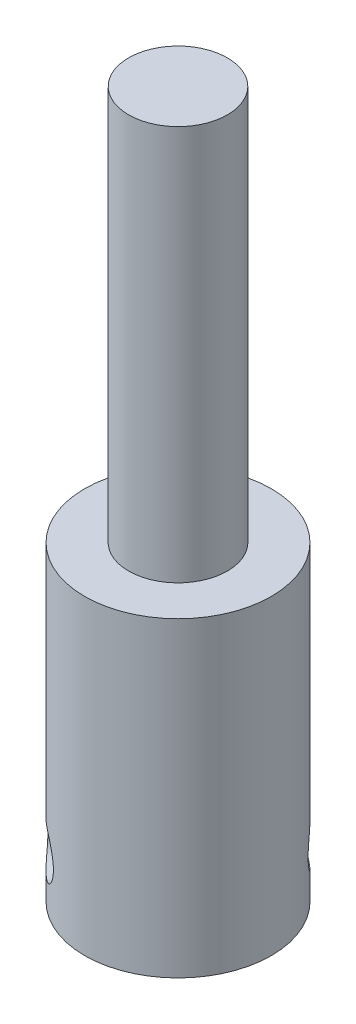
ISO-10303-21;
HEADER;
FILE_DESCRIPTION(('STEP AP214'),'2;1');
FILE_NAME('part.step','',(''),(''),'','','');
FILE_SCHEMA(('AUTOMOTIVE_DESIGN { 1 0 10303 214 1 1 1 1 }'));
ENDSEC;
DATA;
#1=APPLICATION_CONTEXT('core data for automotive mechanical design processes');
#2=APPLICATION_PROTOCOL_DEFINITION('international standard','automotive_design',2000,#1);
#3=PRODUCT_CONTEXT('',#1,'mechanical');
#4=PRODUCT('Part','Part','',(#3));
#5=PRODUCT_RELATED_PRODUCT_CATEGORY('part','',(#4));
#6=PRODUCT_DEFINITION_FORMATION('','',#4);
#7=PRODUCT_DEFINITION_CONTEXT('part definition',#1,'design');
#8=PRODUCT_DEFINITION('design','',#6,#7);
#9=PRODUCT_DEFINITION_SHAPE('','',#8);
#10=(LENGTH_UNIT() NAMED_UNIT(*) SI_UNIT(.MILLI.,.METRE.));
#11=(NAMED_UNIT(*) PLANE_ANGLE_UNIT() SI_UNIT($,.RADIAN.));
#12=(NAMED_UNIT(*) SI_UNIT($,.STERADIAN.) SOLID_ANGLE_UNIT());
#13=UNCERTAINTY_MEASURE_WITH_UNIT(LENGTH_MEASURE(1.E-05),#10,'distance_accuracy_value','');
#14=(GEOMETRIC_REPRESENTATION_CONTEXT(3) GLOBAL_UNCERTAINTY_ASSIGNED_CONTEXT((#13)) GLOBAL_UNIT_ASSIGNED_CONTEXT((#10,
#11,#12)) REPRESENTATION_CONTEXT('',''));
#15=CARTESIAN_POINT('',(0.,0.,0.));
#16=DIRECTION('',(0.,0.,1.));
#17=DIRECTION('',(1.,0.,0.));
#18=AXIS2_PLACEMENT_3D('',#15,#16,#17);
#19=CARTESIAN_POINT('',(0.,20.,0.));
#20=DIRECTION('',(0.,1.,0.));
#21=DIRECTION('',(0.,0.,1.));
#22=AXIS2_PLACEMENT_3D('',#19,#20,#21);
#23=PLANE('',#22);
#24=CARTESIAN_POINT('',(0.,20.,0.));
#25=DIRECTION('',(0.,1.,0.));
#26=DIRECTION('',(0.,0.,1.));
#27=AXIS2_PLACEMENT_3D('',#24,#25,#26);
#28=CIRCLE('',#27,6.00000000000001);
#29=CARTESIAN_POINT('',(0.,20.,6.00000000000001));
#30=VERTEX_POINT('',#29);
#31=EDGE_CURVE('E43',#30,#30,#28,.T.);
#32=ORIENTED_EDGE('',*,*,#31,.T.);
#33=EDGE_LOOP('',(#32));
#34=FACE_BOUND('',#33,.T.);
#35=CARTESIAN_POINT('',(0.,20.,0.));
#36=DIRECTION('',(0.,1.,0.));
#37=DIRECTION('',(0.,0.,1.));
#38=AXIS2_PLACEMENT_3D('',#35,#36,#37);
#39=CIRCLE('',#38,3.175);
#40=CARTESIAN_POINT('',(0.,20.,3.175));
#41=VERTEX_POINT('',#40);
#42=EDGE_CURVE('E105',#41,#41,#39,.T.);
#43=ORIENTED_EDGE('',*,*,#42,.F.);
#44=EDGE_LOOP('',(#43));
#45=FACE_BOUND('',#44,.T.);
#46=ADVANCED_FACE('F31',(#34,#45),#23,.T.);
#47=CARTESIAN_POINT('',(0.,20.,0.));
#48=DIRECTION('',(0.,-1.,0.));
#49=DIRECTION('',(0.,0.,-1.));
#50=AXIS2_PLACEMENT_3D('',#47,#48,#49);
#51=CYLINDRICAL_SURFACE('',#50,6.00000000000001);
#52=CARTESIAN_POINT('',(4.89662563452867,3.17484795335263,-3.46742806634496));
#53=CARTESIAN_POINT('',(4.89662485894614,3.2576784039074,-3.46743079298149));
#54=CARTESIAN_POINT('',(4.8925253121487,3.34053489255943,-3.47324075215723));
#55=CARTESIAN_POINT('',(4.87616284876844,3.50386850025705,-3.49617325525548));
#56=CARTESIAN_POINT('',(4.86389518114053,3.58434420603362,-3.51330238300854));
#57=CARTESIAN_POINT('',(4.83133261108637,3.74053007626485,-3.55794630959264));
#58=CARTESIAN_POINT('',(4.81104807048021,3.81624624658403,-3.58544770016953));
#59=CARTESIAN_POINT('',(4.7626331867595,3.96103446487658,-3.64951098563144));
#60=CARTESIAN_POINT('',(4.73450251054492,4.03010623060076,-3.68607326518032));
#61=CARTESIAN_POINT('',(4.67000890413774,4.16116494050995,-3.76746051506669));
#62=CARTESIAN_POINT('',(4.63349370459921,4.22298411356265,-3.81243503910686));
#63=CARTESIAN_POINT('',(4.55294291274857,4.33630478996883,-3.90827621542361));
#64=CARTESIAN_POINT('',(4.50890661806883,4.38780532872567,-3.95914341785308));
#65=CARTESIAN_POINT('',(4.41323308140103,4.47971323393139,-4.06553252192206));
#66=CARTESIAN_POINT('',(4.36149835428832,4.5199557862495,-4.12110946863815));
#67=CARTESIAN_POINT('',(4.2518312327126,4.58713373984447,-4.2341615281683));
#68=CARTESIAN_POINT('',(4.1938997542093,4.61407110450193,-4.29163635958471));
#69=CARTESIAN_POINT('',(4.07439399292291,4.65333665409977,-4.40522062719656));
#70=CARTESIAN_POINT('',(4.01291728164471,4.66594973994857,-4.46133413646471));
#71=CARTESIAN_POINT('',(3.88693454474598,4.67710298091795,-4.57151376009481));
#72=CARTESIAN_POINT('',(3.82242896840383,4.67564521667838,-4.62558017597109));
#73=CARTESIAN_POINT('',(3.69378018929982,4.65890304320254,-4.72891623351774));
#74=CARTESIAN_POINT('',(3.62966070655722,4.64392615832031,-4.77826569235987));
#75=CARTESIAN_POINT('',(3.50235941489659,4.60106519132352,-4.87234511672274));
#76=CARTESIAN_POINT('',(3.43917765607811,4.57318042212618,-4.91707483618111));
#77=CARTESIAN_POINT('',(3.3152115152108,4.50504641094038,-5.00150507628052));
#78=CARTESIAN_POINT('',(3.25445395275212,4.46468772655557,-5.04115650398639));
#79=CARTESIAN_POINT('',(3.13795540722681,4.37283454588287,-5.11448737407984));
#80=CARTESIAN_POINT('',(3.08221529932357,4.32133811221625,-5.14816577561978));
#81=CARTESIAN_POINT('',(2.9762563295335,4.2070227081632,-5.2101605620983));
#82=CARTESIAN_POINT('',(2.92622772783763,4.14393501794396,-5.23830715646718));
#83=CARTESIAN_POINT('',(2.8354259253561,4.00908796922847,-5.28800972948277));
#84=CARTESIAN_POINT('',(2.79465315716845,3.93732820565802,-5.30956540010003));
#85=CARTESIAN_POINT('',(2.7239206521514,3.78667393286324,-5.34620032659485));
#86=CARTESIAN_POINT('',(2.69401430528866,3.70774651516471,-5.36124767216186));
#87=CARTESIAN_POINT('',(2.64671760680476,3.54529667250675,-5.38475542951298));
#88=CARTESIAN_POINT('',(2.62932457686258,3.46177523496275,-5.39321725087898));
#89=CARTESIAN_POINT('',(2.60822098739137,3.29487225243876,-5.40345429629292));
#90=CARTESIAN_POINT('',(2.60416117761287,3.21154527735485,-5.40540022486696));
#91=CARTESIAN_POINT('',(2.60894630272862,3.04535479140573,-5.40309228939704));
#92=CARTESIAN_POINT('',(2.61779004969483,2.96249123858188,-5.39883899606625));
#93=CARTESIAN_POINT('',(2.64768597888494,2.80097939437981,-5.38423860088393));
#94=CARTESIAN_POINT('',(2.66853604487713,2.72228431741013,-5.37399234171036));
#95=CARTESIAN_POINT('',(2.72132723525573,2.56978907864162,-5.3474522357995));
#96=CARTESIAN_POINT('',(2.75326967346858,2.49598949791943,-5.33115767266032));
#97=CARTESIAN_POINT('',(2.82762525737383,2.35378318663222,-5.29210040473485));
#98=CARTESIAN_POINT('',(2.87023151648903,2.28551064932677,-5.26921708382239));
#99=CARTESIAN_POINT('',(2.96388975769978,2.15773493567182,-5.21710872446515));
#100=CARTESIAN_POINT('',(3.01494312761178,2.09823320336259,-5.18788264369153));
#101=CARTESIAN_POINT('',(3.12499582799806,1.98816132781006,-5.12236234498093));
#102=CARTESIAN_POINT('',(3.18416201367092,1.93785191582335,-5.08590957082877));
#103=CARTESIAN_POINT('',(3.30726304201433,1.84948643318189,-5.00673134960508));
#104=CARTESIAN_POINT('',(3.37119763573539,1.81142972338771,-4.96400622988813));
#105=CARTESIAN_POINT('',(3.50111091188824,1.74898033263588,-4.87323808211709));
#106=CARTESIAN_POINT('',(3.56707114043384,1.7244893827252,-4.82523640083326));
#107=CARTESIAN_POINT('',(3.69923459874202,1.68957175258759,-4.72467464108479));
#108=CARTESIAN_POINT('',(3.76543777913389,1.67914235810921,-4.67211544442622));
#109=CARTESIAN_POINT('',(3.89417827712817,1.67279656898934,-4.56532397072738));
#110=CARTESIAN_POINT('',(3.95676631430621,1.67649538970955,-4.51117535615051));
#111=CARTESIAN_POINT('',(4.07838976515126,1.69741969429414,-4.40152719576681));
#112=CARTESIAN_POINT('',(4.13742528441793,1.71464477587229,-4.34602769018456));
#113=CARTESIAN_POINT('',(4.25020092373664,1.76192628300903,-4.23579768130929));
#114=CARTESIAN_POINT('',(4.30396784005603,1.79191313332458,-4.1810646466031));
#115=CARTESIAN_POINT('',(4.4055171464449,1.86380382188163,-4.0739260422507));
#116=CARTESIAN_POINT('',(4.45329878102149,1.90570916235699,-4.02152076696393));
#117=CARTESIAN_POINT('',(4.54320713222031,2.00142080434825,-3.91969350968062));
#118=CARTESIAN_POINT('',(4.58517094901026,2.05548816771371,-3.87037307669371));
#119=CARTESIAN_POINT('',(4.66154018626199,2.17348223131334,-3.77804722981561));
#120=CARTESIAN_POINT('',(4.69594368790842,2.2374114274995,-3.73504342000575));
#121=CARTESIAN_POINT('',(4.75740763398115,2.37475007465464,-3.65644830207001));
#122=CARTESIAN_POINT('',(4.78431911288195,2.44831413847158,-3.62101024830584));
#123=CARTESIAN_POINT('',(4.82966067130263,2.60193118823669,-3.56031224363114));
#124=CARTESIAN_POINT('',(4.84809692221621,2.68197940251275,-3.53504488841173));
#125=CARTESIAN_POINT('',(4.87366029464848,2.83071347109271,-3.49968748077623));
#126=CARTESIAN_POINT('',(4.88226621351017,2.89868769992843,-3.48763157991128));
#127=CARTESIAN_POINT('',(4.89374896404775,3.03605125685258,-3.47150107071708));
#128=CARTESIAN_POINT('',(4.89662628442537,3.10544046372022,-3.46742578156931));
#129=CARTESIAN_POINT('',(4.89662563452867,3.17484795335263,-3.46742806634496));
#130=B_SPLINE_CURVE_WITH_KNOTS('',3,(#52,#53,#54,#55,#56,#57,#58,#59,#60,#61,#62,#63,#64,#65,
#66,#67,#68,#69,#70,#71,#72,#73,#74,#75,#76,#77,#78,#79,#80,#81,#82,#83,#84,#85,#86,#87,#88,#89,
#90,#91,#92,#93,#94,#95,#96,#97,#98,#99,#100,#101,#102,#103,#104,#105,#106,#107,#108,#109,#110,
#111,#112,#113,#114,#115,#116,#117,#118,#119,#120,#121,#122,#123,#124,#125,#126,#127,#128,#129),
.UNSPECIFIED.,.T.,.F.,(4,2,2,2,2,2,2,2,2,2,2,2,2,2,2,2,2,2,2,2,2,2,2,2,2,2,2,2,2,2,2,2,2,2,2,2,
2,2,4),(0.,0.24823646504168,0.496617444857197,0.744678436299609,0.992749960532867,
1.24574372515785,1.49876112887919,1.75530897838751,2.01181895908254,2.26313250597207,
2.51440889199611,2.76010957613367,3.0058233403487,3.25375724552665,3.50173431281346,
3.75642279943145,4.01112318719879,4.26705859205039,4.52293920077726,4.77206144857028,
5.02116076310278,5.26618443005521,5.51123712852848,5.76109707515491,6.01099811331023,
6.26715198579188,6.52329249431729,6.77755243684154,7.03176329345419,7.2791006767647,
7.52643070426184,7.77242925935822,8.01845883442839,8.27038257949238,8.52237018939301,
8.77905886370801,9.03556032819967,9.24358696306393,9.45159585059707),.UNSPECIFIED.);
#131=CARTESIAN_POINT('',(4.89662563452867,3.17484795335263,-3.46742806634496));
#132=VERTEX_POINT('',#131);
#133=EDGE_CURVE('E36',#132,#132,#130,.T.);
#134=ORIENTED_EDGE('',*,*,#133,.T.);
#135=EDGE_LOOP('',(#134));
#136=FACE_BOUND('',#135,.T.);
#137=CARTESIAN_POINT('',(-2.60588603582183,3.17484795335263,5.40456824994456));
#138=CARTESIAN_POINT('',(-2.60588885340934,3.09201750279786,5.40456793805411));
#139=CARTESIAN_POINT('',(-2.61229906695593,3.00916101414583,5.40149042739526));
#140=CARTESIAN_POINT('',(-2.63763092314554,2.84582740644821,5.38916456157535));
#141=CARTESIAN_POINT('',(-2.65655984734183,2.76535170067164,5.37991261500284));
#142=CARTESIAN_POINT('',(-2.7059924751468,2.60916583044041,5.35521815291771));
#143=CARTESIAN_POINT('',(-2.73648123558996,2.53344966012123,5.33978362804958));
#144=CARTESIAN_POINT('',(-2.80769664157322,2.38866144182868,5.30268279975015));
#145=CARTESIAN_POINT('',(-2.84842372176394,2.3195896761045,5.2810162317423));
#146=CARTESIAN_POINT('',(-2.93939323019589,2.18853096619531,5.2309377109263));
#147=CARTESIAN_POINT('',(-2.98980842768533,2.12671179314261,5.20240044630476));
#148=CARTESIAN_POINT('',(-3.09769829507203,2.01339111673643,5.13888873352023));
#149=CARTESIAN_POINT('',(-3.15517362414836,1.96189057797959,5.10391368413228));
#150=CARTESIAN_POINT('',(-3.27597689745842,1.86998267277387,5.0272414189988));
#151=CARTESIAN_POINT('',(-3.33937531515517,1.82974012045576,4.98545721589214));
#152=CARTESIAN_POINT('',(-3.46907343112187,1.76256216686079,4.8960925448336));
#153=CARTESIAN_POINT('',(-3.53537269975486,1.73562480220333,4.84851293337394));
#154=CARTESIAN_POINT('',(-3.66722991103876,1.69635925260549,4.74953471020341));
#155=CARTESIAN_POINT('',(-3.73277566272825,1.68374616675669,4.69823299105651));
#156=CARTESIAN_POINT('',(-3.86235140927727,1.67259292578731,4.59230223364379));
#157=CARTESIAN_POINT('',(-3.9263816268334,1.67405069002688,4.53767368849883));
#158=CARTESIAN_POINT('',(-4.04965173364571,1.69079286350273,4.4279771529076));
#159=CARTESIAN_POINT('',(-4.10896639111815,1.70576974838495,4.37294581125473));
#160=CARTESIAN_POINT('',(-4.22288463355498,1.74863071538174,4.26304043837869));
#161=CARTESIAN_POINT('',(-4.27748796755344,1.77651548457908,4.20816641568605));
#162=CARTESIAN_POINT('',(-4.381337080426,1.84464949576488,4.09994704921054));
#163=CARTESIAN_POINT('',(-4.43052999342893,1.88500818014969,4.04661999767644));
#164=CARTESIAN_POINT('',(-4.5221935038554,1.97686136082239,3.94392078407442));
#165=CARTESIAN_POINT('',(-4.56466292951927,2.02835779448901,3.89454931211812));
#166=CARTESIAN_POINT('',(-4.64339713061327,2.14267319854206,3.8003602341548));
#167=CARTESIAN_POINT('',(-4.67946287046955,2.2057608887613,3.75570204150408));
#168=CARTESIAN_POINT('',(-4.74355789456191,2.34060793747679,3.67441771961563));
#169=CARTESIAN_POINT('',(-4.77158680318966,2.41236770104724,3.63779196579976));
#170=CARTESIAN_POINT('',(-4.81946204373041,2.56302197384201,3.57412748238527));
#171=CARTESIAN_POINT('',(-4.83926804012378,2.64194939154055,3.54713610046153));
#172=CARTESIAN_POINT('',(-4.87030559589176,2.8043992341985,3.50440130813601));
#173=CARTESIAN_POINT('',(-4.8815389901573,2.88792067174251,3.48865549076521));
#174=CARTESIAN_POINT('',(-4.89513930135797,3.0548236542665,3.46954554250204));
#175=CARTESIAN_POINT('',(-4.8977325647143,3.13815062935041,3.46586536878092));
#176=CARTESIAN_POINT('',(-4.89466184265701,3.30434111529953,3.47020064899719));
#177=CARTESIAN_POINT('',(-4.88899861735279,3.38720466812337,3.4782150263101));
#178=CARTESIAN_POINT('',(-4.86963509254677,3.54871651232545,3.5052703775129));
#179=CARTESIAN_POINT('',(-4.85606780797427,3.62741158929513,3.5241287938902));
#180=CARTESIAN_POINT('',(-4.82112734917393,3.77990682806364,3.57177804721246));
#181=CARTESIAN_POINT('',(-4.79975325025915,3.85370640878583,3.60057006073115));
#182=CARTESIAN_POINT('',(-4.74888749675353,3.99591272007304,3.66740491807369));
#183=CARTESIAN_POINT('',(-4.71924482393032,4.06418525737849,3.70561815713648));
#184=CARTESIAN_POINT('',(-4.6523029573592,4.19196097103344,3.78931961328612));
#185=CARTESIAN_POINT('',(-4.61500250523502,4.25146270334267,3.83480902576958));
#186=CARTESIAN_POINT('',(-4.53211176696719,4.3615345788952,3.93244934487419));
#187=CARTESIAN_POINT('',(-4.48633741129726,4.41184399088191,3.98473845113417));
#188=CARTESIAN_POINT('',(-4.38781105607927,4.50020947352337,4.09297712824549));
#189=CARTESIAN_POINT('',(-4.3350594206906,4.53826618331755,4.14892650798223));
#190=CARTESIAN_POINT('',(-4.22397258029037,4.60071557406938,4.26195760927937));
#191=CARTESIAN_POINT('',(-4.16568121298477,4.62520652398006,4.31902800137114));
#192=CARTESIAN_POINT('',(-4.04456304419988,4.66012415411767,4.43265122270322));
#193=CARTESIAN_POINT('',(-3.98173712047702,4.67055354859605,4.48920414973413));
#194=CARTESIAN_POINT('',(-3.85504436661889,4.67689933771592,4.59841715627833));
#195=CARTESIAN_POINT('',(-3.79125161171701,4.67320051699571,4.65114114778527));
#196=CARTESIAN_POINT('',(-3.6629240591957,4.65227621241112,4.75286146107066));
#197=CARTESIAN_POINT('',(-3.59838928370103,4.63505113083297,4.80185789366337));
#198=CARTESIAN_POINT('',(-3.47095766205194,4.58776962369623,4.89475666375356));
#199=CARTESIAN_POINT('',(-3.40805386856626,4.55778277338068,4.93868500476204));
#200=CARTESIAN_POINT('',(-3.28553549255976,4.48589208482363,5.02102691214442));
#201=CARTESIAN_POINT('',(-3.22592132580271,4.44398674434827,5.05943978241671));
#202=CARTESIAN_POINT('',(-3.11057416967206,4.34827510235701,5.13118471613125));
#203=CARTESIAN_POINT('',(-3.05496837757239,4.29420773899155,5.16437301097392));
#204=CARTESIAN_POINT('',(-2.95123959433731,4.17621367539192,5.2243451872621));
#205=CARTESIAN_POINT('',(-2.90311850372992,4.11228447920576,5.2511274430008));
#206=CARTESIAN_POINT('',(-2.81540558964522,3.97494583205062,5.29868218969276));
#207=CARTESIAN_POINT('',(-2.77598963587134,3.90138176823368,5.31933324146536));
#208=CARTESIAN_POINT('',(-2.70860326371739,3.74776471846857,5.35396244214102));
#209=CARTESIAN_POINT('',(-2.68062451877236,3.66771650419251,5.36794544678358));
#210=CARTESIAN_POINT('',(-2.64151202259158,3.51898243561255,5.38728051666508));
#211=CARTESIAN_POINT('',(-2.62819409277024,3.45100820677683,5.39376429105917));
#212=CARTESIAN_POINT('',(-2.61038029516038,3.31364464985268,5.4024081039613));
#213=CARTESIAN_POINT('',(-2.60588367483412,3.24425544298504,5.40456851129209));
#214=CARTESIAN_POINT('',(-2.60588603582183,3.17484795335263,5.40456824994456));
#215=B_SPLINE_CURVE_WITH_KNOTS('',3,(#137,#138,#139,#140,#141,#142,#143,#144,#145,#146,#147,
#148,#149,#150,#151,#152,#153,#154,#155,#156,#157,#158,#159,#160,#161,#162,#163,#164,#165,#166,
#167,#168,#169,#170,#171,#172,#173,#174,#175,#176,#177,#178,#179,#180,#181,#182,#183,#184,#185,
#186,#187,#188,#189,#190,#191,#192,#193,#194,#195,#196,#197,#198,#199,#200,#201,#202,#203,#204,
#205,#206,#207,#208,#209,#210,#211,#212,#213,#214),.UNSPECIFIED.,.T.,.F.,(4,2,2,2,2,2,2,2,2,2,2,
2,2,2,2,2,2,2,2,2,2,2,2,2,2,2,2,2,2,2,2,2,2,2,2,2,2,2,4),(0.,0.24823646504168,0.496617444857197,
0.744678436299608,0.992749960532866,1.24574372515785,1.49876112887919,1.75530897838751,
2.01181895908254,2.26313250597207,2.51440889199611,2.76010957613367,3.0058233403487,
3.25375724552665,3.50173431281346,3.75642279943145,4.01112318719879,4.26705859205039,
4.52293920077726,4.77206144857028,5.02116076310278,5.26618443005521,5.51123712852847,
5.76109707515491,6.01099811331023,6.26715198579188,6.52329249431728,6.77755243684154,
7.03176329345419,7.2791006767647,7.52643070426184,7.77242925935822,8.01845883442839,
8.27038257949238,8.522370189393,8.77905886370801,9.03556032819967,9.24358696306393,
9.45159585059707),.UNSPECIFIED.);
#216=CARTESIAN_POINT('',(-2.60588603582183,3.17484795335263,5.40456824994456));
#217=VERTEX_POINT('',#216);
#218=EDGE_CURVE('E10',#217,#217,#215,.T.);
#219=ORIENTED_EDGE('',*,*,#218,.T.);
#220=EDGE_LOOP('',(#219));
#221=FACE_BOUND('',#220,.T.);
#222=ORIENTED_EDGE('',*,*,#31,.F.);
#223=EDGE_LOOP('',(#222));
#224=FACE_BOUND('',#223,.T.);
#225=CARTESIAN_POINT('',(0.,0.,0.));
#226=DIRECTION('',(0.,1.,0.));
#227=DIRECTION('',(0.,0.,1.));
#228=AXIS2_PLACEMENT_3D('',#225,#226,#227);
#229=CIRCLE('',#228,6.00000000000001);
#230=CARTESIAN_POINT('',(0.,0.,6.00000000000001));
#231=VERTEX_POINT('',#230);
#232=EDGE_CURVE('E47',#231,#231,#229,.T.);
#233=ORIENTED_EDGE('',*,*,#232,.T.);
#234=EDGE_LOOP('',(#233));
#235=FACE_BOUND('',#234,.T.);
#236=ADVANCED_FACE('F33',(#136,#221,#224,#235),#51,.T.);
#237=CARTESIAN_POINT('',(0.,0.,0.));
#238=DIRECTION('',(0.,1.,0.));
#239=DIRECTION('',(0.,0.,1.));
#240=AXIS2_PLACEMENT_3D('',#237,#238,#239);
#241=PLANE('',#240);
#242=CARTESIAN_POINT('',(0.,0.,0.));
#243=DIRECTION('',(0.,-1.,0.));
#244=DIRECTION('',(0.,0.,-1.));
#245=AXIS2_PLACEMENT_3D('',#242,#243,#244);
#246=CIRCLE('',#245,2.5);
#247=CARTESIAN_POINT('',(0.,0.,-2.5));
#248=VERTEX_POINT('',#247);
#249=EDGE_CURVE('E99',#248,#248,#246,.T.);
#250=ORIENTED_EDGE('',*,*,#249,.F.);
#251=EDGE_LOOP('',(#250));
#252=FACE_BOUND('',#251,.T.);
#253=ORIENTED_EDGE('',*,*,#232,.F.);
#254=EDGE_LOOP('',(#253));
#255=FACE_BOUND('',#254,.T.);
#256=ADVANCED_FACE('F86',(#252,#255),#241,.F.);
#257=CARTESIAN_POINT('',(0.,45.4,0.));
#258=DIRECTION('',(0.,-1.,0.));
#259=DIRECTION('',(0.,0.,-1.));
#260=AXIS2_PLACEMENT_3D('',#257,#258,#259);
#261=CYLINDRICAL_SURFACE('',#260,3.175);
#262=CARTESIAN_POINT('',(0.,45.4,0.));
#263=DIRECTION('',(0.,1.,0.));
#264=DIRECTION('',(0.,0.,1.));
#265=AXIS2_PLACEMENT_3D('',#262,#263,#264);
#266=CIRCLE('',#265,3.175);
#267=CARTESIAN_POINT('',(0.,45.4,3.175));
#268=VERTEX_POINT('',#267);
#269=EDGE_CURVE('E103',#268,#268,#266,.T.);
#270=ORIENTED_EDGE('',*,*,#269,.F.);
#271=EDGE_LOOP('',(#270));
#272=FACE_BOUND('',#271,.T.);
#273=ORIENTED_EDGE('',*,*,#42,.T.);
#274=EDGE_LOOP('',(#273));
#275=FACE_BOUND('',#274,.T.);
#276=ADVANCED_FACE('F82',(#272,#275),#261,.T.);
#277=CARTESIAN_POINT('',(0.,45.4,0.));
#278=DIRECTION('',(0.,1.,0.));
#279=DIRECTION('',(0.,0.,1.));
#280=AXIS2_PLACEMENT_3D('',#277,#278,#279);
#281=PLANE('',#280);
#282=ORIENTED_EDGE('',*,*,#269,.T.);
#283=EDGE_LOOP('',(#282));
#284=FACE_BOUND('',#283,.T.);
#285=ADVANCED_FACE('F77',(#284),#281,.T.);
#286=CARTESIAN_POINT('',(0.,6.5,0.));
#287=DIRECTION('',(0.,-1.,0.));
#288=DIRECTION('',(0.,0.,-1.));
#289=AXIS2_PLACEMENT_3D('',#286,#287,#288);
#290=CYLINDRICAL_SURFACE('',#289,2.5);
#291=CARTESIAN_POINT('',(2.43679658841984,3.17484795335263,-0.558589640671442));
#292=CARTESIAN_POINT('',(2.43679590729424,3.09936897806299,-0.558582576887806));
#293=CARTESIAN_POINT('',(2.43522018417812,3.02390951927284,-0.565601669937329));
#294=CARTESIAN_POINT('',(2.42873732899896,2.87552404939042,-0.592809869690468));
#295=CARTESIAN_POINT('',(2.4238267200391,2.80260076596753,-0.613012720701844));
#296=CARTESIAN_POINT('',(2.41025250858243,2.66176431167536,-0.664358875580718));
#297=CARTESIAN_POINT('',(2.40161592475778,2.59381911531737,-0.695423117045619));
#298=CARTESIAN_POINT('',(2.3799693976656,2.46341049998471,-0.766234099637743));
#299=CARTESIAN_POINT('',(2.3669581494961,2.4009487236575,-0.805983430166944));
#300=CARTESIAN_POINT('',(2.33395577618096,2.27489893668855,-0.897377562252009));
#301=CARTESIAN_POINT('',(2.3133057459409,2.21210699622869,-0.949882568470117));
#302=CARTESIAN_POINT('',(2.26461222908602,2.09508319061088,-1.06075589520079));
#303=CARTESIAN_POINT('',(2.23656319125552,2.04085780168183,-1.11912859760203));
#304=CARTESIAN_POINT('',(2.16870439134893,1.93671414364294,-1.24596554516378));
#305=CARTESIAN_POINT('',(2.12795164881651,1.88789348968289,-1.31483882382585));
#306=CARTESIAN_POINT('',(2.035593180035,1.8040382309082,-1.45371576274672));
#307=CARTESIAN_POINT('',(1.98399747702963,1.76899097922992,-1.52371832429932));
#308=CARTESIAN_POINT('',(1.87572183791198,1.71725203053999,-1.65474656773664));
#309=CARTESIAN_POINT('',(1.81999727587503,1.69912759238534,-1.71599131706405));
#310=CARTESIAN_POINT('',(1.70126511867231,1.67690515048952,-1.83375672920709));
#311=CARTESIAN_POINT('',(1.63826442014871,1.67279397535258,-1.89028177939214));
#312=CARTESIAN_POINT('',(1.51542343487239,1.6784617006951,-1.9897126469806));
#313=CARTESIAN_POINT('',(1.45615992258995,1.68658147952195,-2.03343812114001));
#314=CARTESIAN_POINT('',(1.33569415910715,1.71332774900075,-2.11451930230059));
#315=CARTESIAN_POINT('',(1.27449176473618,1.73195501725979,-2.15187453760555));
#316=CARTESIAN_POINT('',(1.15173091072886,1.77901351605642,-2.22001793266058));
#317=CARTESIAN_POINT('',(1.09017244592723,1.80750101449164,-2.25076672371515));
#318=CARTESIAN_POINT('',(0.968821729977469,1.87323256957818,-2.30560716209737));
#319=CARTESIAN_POINT('',(0.909029942083381,1.91047890041165,-2.32969707694495));
#320=CARTESIAN_POINT('',(0.785823244333317,1.99768704615709,-2.37429343717483));
#321=CARTESIAN_POINT('',(0.722828627825544,2.04863626508838,-2.3940281605309));
#322=CARTESIAN_POINT('',(0.602983120397492,2.15925207121281,-2.42699074043694));
#323=CARTESIAN_POINT('',(0.546140728723916,2.21893045682714,-2.44020968282267));
#324=CARTESIAN_POINT('',(0.434685031229413,2.35350135951619,-2.46264848946567));
#325=CARTESIAN_POINT('',(0.381093449743278,2.4293555298921,-2.471227375449));
#326=CARTESIAN_POINT('',(0.28793053760896,2.58955418498924,-2.48381115664225));
#327=CARTESIAN_POINT('',(0.248333400061958,2.67388266947828,-2.4878245017425));
#328=CARTESIAN_POINT('',(0.194707421841275,2.82724158524798,-2.49251394101334));
#329=CARTESIAN_POINT('',(0.176775086740643,2.89488858564928,-2.49377036909375));
#330=CARTESIAN_POINT('',(0.152553110931247,3.03222156365212,-2.49537213449996));
#331=CARTESIAN_POINT('',(0.146249929787524,3.1019050738372,-2.49571853162219));
#332=CARTESIAN_POINT('',(0.145872542388997,3.24139963578834,-2.49574061989477));
#333=CARTESIAN_POINT('',(0.151815278431123,3.31121073056784,-2.49541538183265));
#334=CARTESIAN_POINT('',(0.175385060124768,3.44883529710119,-2.49386712453645));
#335=CARTESIAN_POINT('',(0.193021341372117,3.51664714559288,-2.49264339558958));
#336=CARTESIAN_POINT('',(0.238488377858332,3.64856253283242,-2.48870174206637));
#337=CARTESIAN_POINT('',(0.266306394637789,3.71267058988486,-2.48598568243929));
#338=CARTESIAN_POINT('',(0.330411525223929,3.83632566908281,-2.47827939199055));
#339=CARTESIAN_POINT('',(0.366701833219395,3.89587095971863,-2.47328830276884));
#340=CARTESIAN_POINT('',(0.453318243610389,4.02008803586488,-2.45901524243764));
#341=CARTESIAN_POINT('',(0.504995249989974,4.0837487884492,-2.44912193153933));
#342=CARTESIAN_POINT('',(0.615680476345031,4.20313343820209,-2.42366843278785));
#343=CARTESIAN_POINT('',(0.674695697246952,4.25884964552174,-2.40810280558246));
#344=CARTESIAN_POINT('',(0.806092545716722,4.36807196070305,-2.36759975615783));
#345=CARTESIAN_POINT('',(0.879214392998149,4.42034867995846,-2.34170690925691));
#346=CARTESIAN_POINT('',(1.02928924079405,4.51175073018928,-2.27972294540282));
#347=CARTESIAN_POINT('',(1.10623966201394,4.55088478119355,-2.24363861977364));
#348=CARTESIAN_POINT('',(1.25499439051081,4.61171615678399,-2.16369784742475));
#349=CARTESIAN_POINT('',(1.32676617434685,4.63447418114373,-2.12059702211203));
#350=CARTESIAN_POINT('',(1.46759032767869,4.66556255619888,-2.02567501473933));
#351=CARTESIAN_POINT('',(1.53664568966596,4.67390924407024,-1.97386378033869));
#352=CARTESIAN_POINT('',(1.66021690562933,4.67552256193855,-1.87063825800729));
#353=CARTESIAN_POINT('',(1.71544376791461,4.67065128791565,-1.820091931187));
#354=CARTESIAN_POINT('',(1.82012450439511,4.64995412897101,-1.71540760807689));
#355=CARTESIAN_POINT('',(1.86957831428058,4.63412812203102,-1.66126957178725));
#356=CARTESIAN_POINT('',(1.96104581105961,4.59262838176884,-1.55218960083145));
#357=CARTESIAN_POINT('',(2.00316593274752,4.56711635722338,-1.49727441083236));
#358=CARTESIAN_POINT('',(2.0806652029168,4.50720735879787,-1.38756930382719));
#359=CARTESIAN_POINT('',(2.11604283665855,4.47280839249302,-1.33277941769642));
#360=CARTESIAN_POINT('',(2.18372424693135,4.39192275678386,-1.21909229347865));
#361=CARTESIAN_POINT('',(2.21527738292188,4.34452924433575,-1.16039488049958));
#362=CARTESIAN_POINT('',(2.27098811130286,4.24109491963489,-1.04718794532221));
#363=CARTESIAN_POINT('',(2.29513742121498,4.18504452774471,-0.992683163987829));
#364=CARTESIAN_POINT('',(2.33950984347086,4.05756239117492,-0.883507860698961));
#365=CARTESIAN_POINT('',(2.35884670260646,3.98508146718712,-0.829692844454919));
#366=CARTESIAN_POINT('',(2.39045925418889,3.83136310058608,-0.733666653755073));
#367=CARTESIAN_POINT('',(2.40273861991823,3.7501302393712,-0.691449448857228));
#368=CARTESIAN_POINT('',(2.420664656478,3.58778366821542,-0.625664006142386));
#369=CARTESIAN_POINT('',(2.42678836571073,3.50725271739138,-0.600810635731271));
#370=CARTESIAN_POINT('',(2.43485018769213,3.34275055864895,-0.567294873110508));
#371=CARTESIAN_POINT('',(2.43679734589118,3.25878718759392,-0.558597496217798));
#372=CARTESIAN_POINT('',(2.43679658841984,3.17484795335263,-0.558589640671442));
#373=B_SPLINE_CURVE_WITH_KNOTS('',3,(#291,#292,#293,#294,#295,#296,#297,#298,#299,#300,#301,
#302,#303,#304,#305,#306,#307,#308,#309,#310,#311,#312,#313,#314,#315,#316,#317,#318,#319,#320,
#321,#322,#323,#324,#325,#326,#327,#328,#329,#330,#331,#332,#333,#334,#335,#336,#337,#338,#339,
#340,#341,#342,#343,#344,#345,#346,#347,#348,#349,#350,#351,#352,#353,#354,#355,#356,#357,#358,
#359,#360,#361,#362,#363,#364,#365,#366,#367,#368,#369,#370,#371,#372),.UNSPECIFIED.,.T.,.F.,(4,
2,2,2,2,2,2,2,2,2,2,2,2,2,2,2,2,2,2,2,2,2,2,2,2,2,2,2,2,2,2,2,2,2,2,2,2,2,2,2,4),(0.,
0.226085249493391,0.452406574330768,0.677113624991872,0.901887762215928,1.15414462390001,
1.40659128601843,1.68630157736222,1.96575443271219,2.21853330858496,2.47107452602765,
2.6923013054318,2.91354445887943,3.13607155036375,3.35865648368877,3.60782810055847,
3.85733966656906,4.13576671140274,4.41367760154766,4.62276298054681,4.83160475643974,
5.04073566011178,5.25003193304125,5.45906724365492,5.66818149154658,5.91499438481999,
6.16204457978451,6.44121828011585,6.72020638384844,6.97891479383333,7.23732973022722,
7.46129321849395,7.68525920139644,7.90563970188752,8.1260696539458,8.37042963549483,
8.6150619874195,8.89071695766599,9.166228324848,9.41820120134348,9.66962780912271),.UNSPECIFIED.);
#374=CARTESIAN_POINT('',(2.43679658841984,3.17484795335263,-0.558589640671442));
#375=VERTEX_POINT('',#374);
#376=EDGE_CURVE('E69',#375,#375,#373,.T.);
#377=ORIENTED_EDGE('',*,*,#376,.T.);
#378=EDGE_LOOP('',(#377));
#379=FACE_BOUND('',#378,.T.);
#380=CARTESIAN_POINT('',(-0.146056989712995,3.17484795335263,2.49572982427104));
#381=CARTESIAN_POINT('',(-0.146050137203709,3.25032692864227,2.49572797925402));
#382=CARTESIAN_POINT('',(-0.153233458350742,3.32578638743243,2.49534007736547));
#383=CARTESIAN_POINT('',(-0.181140524907038,3.47417185731484,2.49346679647271));
#384=CARTESIAN_POINT('',(-0.201878401223047,3.54709514073773,2.49198027191979));
#385=CARTESIAN_POINT('',(-0.254766020256132,3.6879315950299,2.48712366914346));
#386=CARTESIAN_POINT('',(-0.286833310916388,3.75587679138789,2.48376710130406));
#387=CARTESIAN_POINT('',(-0.36025622207363,3.88628540672055,2.47418359943834));
#388=CARTESIAN_POINT('',(-0.401614612754525,3.94874718304776,2.4679558087599));
#389=CARTESIAN_POINT('',(-0.497221023616359,4.07479697001671,2.45059325635156));
#390=CARTESIAN_POINT('',(-0.552426747748801,4.13758891047657,2.43895163061063));
#391=CARTESIAN_POINT('',(-0.669848169572204,4.25461271609438,2.40935158228308));
#392=CARTESIAN_POINT('',(-0.732069110380115,4.30883810502343,2.39138841346968));
#393=CARTESIAN_POINT('',(-0.868415893317814,4.41298176306232,2.34554102778537));
#394=CARTESIAN_POINT('',(-0.943101723446811,4.46180241702238,2.31679487472938));
#395=CARTESIAN_POINT('',(-1.09539083349288,4.54565767579706,2.24878812593874));
#396=CARTESIAN_POINT('',(-1.17299136502231,4.58070492747534,2.20953723169549));
#397=CARTESIAN_POINT('',(-1.32018479371017,4.63244387616527,2.12453070750049));
#398=CARTESIAN_POINT('',(-1.38983501923351,4.65056831431992,2.0797535680325));
#399=CARTESIAN_POINT('',(-1.52568678632134,4.67279075621574,1.98223272497653));
#400=CARTESIAN_POINT('',(-1.59189150871332,4.67690193135268,1.92949655099809));
#401=CARTESIAN_POINT('',(-1.71034595495802,4.67123420601016,1.82487843947857));
#402=CARTESIAN_POINT('',(-1.76330814138262,4.66311442718331,1.77370141545761));
#403=CARTESIAN_POINT('',(-1.86327327996333,4.63636815770451,1.66837749045275));
#404=CARTESIAN_POINT('',(-1.9102757907581,4.61774088944547,1.61423036993452));
#405=CARTESIAN_POINT('',(-1.9978641153639,4.57068239064884,1.50449416369892));
#406=CARTESIAN_POINT('',(-2.03841110826722,4.54219489221362,1.44889853341606));
#407=CARTESIAN_POINT('',(-2.11264705178361,4.47646333712708,1.33834314171712));
#408=CARTESIAN_POINT('',(-2.1463342170347,4.43921700629361,1.2833835493398));
#409=CARTESIAN_POINT('',(-2.21077669251952,4.35200886054817,1.1692963323976));
#410=CARTESIAN_POINT('',(-2.24070118761346,4.30105964161689,1.11045497272368));
#411=CARTESIAN_POINT('',(-2.29311318309956,4.19044383549245,0.997749781832072));
#412=CARTESIAN_POINT('',(-2.31559048137107,4.13076544987812,0.943892851067473));
#413=CARTESIAN_POINT('',(-2.35623128706066,3.99619454718907,0.837712827237898));
#414=CARTESIAN_POINT('',(-2.37359300397951,3.92034037681316,0.786290792306072));
#415=CARTESIAN_POINT('',(-2.40147710946002,3.76014172171602,0.696512418473518));
#416=CARTESIAN_POINT('',(-2.41201211726517,3.67581323722698,0.658132034794413));
#417=CARTESIAN_POINT('',(-2.42554413521739,3.52245432145728,0.606030011120272));
#418=CARTESIAN_POINT('',(-2.42976182029075,3.45480732105598,0.588555504366014));
#419=CARTESIAN_POINT('',(-2.4353648073965,3.31747434305314,0.56493609920796));
#420=CARTESIAN_POINT('',(-2.43675340368241,3.24779083286806,0.558778024520881));
#421=CARTESIAN_POINT('',(-2.43683787231965,3.10829627091692,0.558409549026886));
#422=CARTESIAN_POINT('',(-2.43553001410935,3.03848517613742,0.564215700795932));
#423=CARTESIAN_POINT('',(-2.43008812668878,2.90086060960407,0.587200860596185));
#424=CARTESIAN_POINT('',(-2.42595186351515,2.83304876111237,0.604388858028389));
#425=CARTESIAN_POINT('',(-2.41451251164818,2.70113337387284,0.648569501620348));
#426=CARTESIAN_POINT('',(-2.40721337796073,2.6370253168204,0.675549896073592));
#427=CARTESIAN_POINT('',(-2.38896574496433,2.51337023762245,0.73748436603964));
#428=CARTESIAN_POINT('',(-2.378015868599,2.45382494698663,0.772441448778462));
#429=CARTESIAN_POINT('',(-2.34955338138853,2.32960787084038,0.855483664681178));
#430=CARTESIAN_POINT('',(-2.33121352726366,2.26594711825606,0.904799385699576));
#431=CARTESIAN_POINT('',(-2.28772789283813,2.14656246850317,1.00971887640827));
#432=CARTESIAN_POINT('',(-2.26257558583864,2.09084626118351,1.06532864624238));
#433=CARTESIAN_POINT('',(-2.20080910178727,1.9816239460022,1.18817216560101));
#434=CARTESIAN_POINT('',(-2.16312981656581,1.92934722674679,1.25597714724457));
#435=CARTESIAN_POINT('',(-2.07707826876333,1.83794517651598,1.39367102088034));
#436=CARTESIAN_POINT('',(-2.02871313160034,1.79881112551171,1.46355849750696));
#437=CARTESIAN_POINT('',(-1.92517352329414,1.73797974992127,1.5969678144444));
#438=CARTESIAN_POINT('',(-1.87074957850115,1.71522172556153,1.66058309822758));
#439=CARTESIAN_POINT('',(-1.75375419739988,1.68413335050638,1.78368350621334));
#440=CARTESIAN_POINT('',(-1.69119207347498,1.67578666263501,1.8431732337242));
#441=CARTESIAN_POINT('',(-1.56887439227914,1.67417334476671,1.9478811070773));
#442=CARTESIAN_POINT('',(-1.50985663349462,1.67904461878961,1.9939445591945));
#443=CARTESIAN_POINT('',(-1.38923828569747,1.69974177773425,2.07978207004965));
#444=CARTESIAN_POINT('',(-1.3276376679231,1.71556778467424,2.11955605872695));
#445=CARTESIAN_POINT('',(-1.20487956926652,1.75706752493643,2.19163374074407));
#446=CARTESIAN_POINT('',(-1.14373078178498,1.78257954948189,2.22404683274681));
#447=CARTESIAN_POINT('',(-1.02267647189641,1.84248854790739,2.28224650145023));
#448=CARTESIAN_POINT('',(-0.962771231546747,1.87688751421224,2.30803158958345));
#449=CARTESIAN_POINT('',(-0.839421053877032,1.9577731499214,2.35588834645509));
#450=CARTESIAN_POINT('',(-0.776297853310923,2.00516666236951,2.37725299556436));
#451=CARTESIAN_POINT('',(-0.655409624759021,2.10860098707037,2.41338513674887));
#452=CARTESIAN_POINT('',(-0.597650647564108,2.16465137896055,2.42814524890758));
#453=CARTESIAN_POINT('',(-0.482621429597933,2.29213351553034,2.45376628946335));
#454=CARTESIAN_POINT('',(-0.426342023543514,2.36461443951814,2.463895383635));
#455=CARTESIAN_POINT('',(-0.326398766063062,2.51833280611918,2.47911799845872));
#456=CARTESIAN_POINT('',(-0.282728357809768,2.59956566733406,2.48421413965498));
#457=CARTESIAN_POINT('',(-0.214879174010916,2.76191223848984,2.49096362243214));
#458=CARTESIAN_POINT('',(-0.189353879485113,2.84244318931388,2.49287390380675));
#459=CARTESIAN_POINT('',(-0.154964598223378,3.00694534805631,2.49525647636857));
#460=CARTESIAN_POINT('',(-0.14606461030376,3.09090871911134,2.49573187609164));
#461=CARTESIAN_POINT('',(-0.146056989712995,3.17484795335263,2.49572982427104));
#462=B_SPLINE_CURVE_WITH_KNOTS('',3,(#380,#381,#382,#383,#384,#385,#386,#387,#388,#389,#390,
#391,#392,#393,#394,#395,#396,#397,#398,#399,#400,#401,#402,#403,#404,#405,#406,#407,#408,#409,
#410,#411,#412,#413,#414,#415,#416,#417,#418,#419,#420,#421,#422,#423,#424,#425,#426,#427,#428,
#429,#430,#431,#432,#433,#434,#435,#436,#437,#438,#439,#440,#441,#442,#443,#444,#445,#446,#447,
#448,#449,#450,#451,#452,#453,#454,#455,#456,#457,#458,#459,#460,#461),.UNSPECIFIED.,.T.,.F.,(4,
2,2,2,2,2,2,2,2,2,2,2,2,2,2,2,2,2,2,2,2,2,2,2,2,2,2,2,2,2,2,2,2,2,2,2,2,2,2,2,4),(0.,
0.226085249493391,0.452406574330768,0.677113624991872,0.901887762215928,1.15414462390001,
1.40659128601843,1.68630157736222,1.96575443271219,2.21853330858496,2.47107452602765,
2.6923013054318,2.91354445887943,3.13607155036375,3.35865648368876,3.60782810055847,
3.85733966656906,4.13576671140274,4.41367760154766,4.62276298054681,4.83160475643974,
5.04073566011178,5.25003193304125,5.45906724365492,5.66818149154658,5.91499438481999,
6.16204457978451,6.44121828011585,6.72020638384844,6.97891479383334,7.23732973022722,
7.46129321849395,7.68525920139644,7.90563970188752,8.1260696539458,8.37042963549483,
8.6150619874195,8.89071695766599,9.166228324848,9.41820120134348,9.66962780912271),.UNSPECIFIED.);
#463=CARTESIAN_POINT('',(-0.146056989712995,3.17484795335263,2.49572982427104));
#464=VERTEX_POINT('',#463);
#465=EDGE_CURVE('E65',#464,#464,#462,.T.);
#466=ORIENTED_EDGE('',*,*,#465,.T.);
#467=EDGE_LOOP('',(#466));
#468=FACE_BOUND('',#467,.T.);
#469=CARTESIAN_POINT('',(0.,6.5,0.));
#470=DIRECTION('',(0.,-1.,0.));
#471=DIRECTION('',(0.,0.,-1.));
#472=AXIS2_PLACEMENT_3D('',#469,#470,#471);
#473=CIRCLE('',#472,2.5);
#474=CARTESIAN_POINT('',(0.,6.5,-2.5));
#475=VERTEX_POINT('',#474);
#476=EDGE_CURVE('E109',#475,#475,#473,.T.);
#477=ORIENTED_EDGE('',*,*,#476,.F.);
#478=EDGE_LOOP('',(#477));
#479=FACE_BOUND('',#478,.T.);
#480=ORIENTED_EDGE('',*,*,#249,.T.);
#481=EDGE_LOOP('',(#480));
#482=FACE_BOUND('',#481,.T.);
#483=ADVANCED_FACE('F73',(#379,#468,#479,#482),#290,.F.);
#484=CARTESIAN_POINT('',(0.,6.5,0.));
#485=DIRECTION('',(0.,-1.,0.));
#486=DIRECTION('',(0.,0.,-1.));
#487=AXIS2_PLACEMENT_3D('',#484,#485,#486);
#488=PLANE('',#487);
#489=ORIENTED_EDGE('',*,*,#476,.T.);
#490=EDGE_LOOP('',(#489));
#491=FACE_BOUND('',#490,.T.);
#492=ADVANCED_FACE('F58',(#491),#488,.T.);
#493=CARTESIAN_POINT('',(-3.87428036719924,3.17484795335263,4.58147919741371));
#494=DIRECTION('',(-0.645713394533205,0.,0.763579866235618));
#495=DIRECTION('',(0.763579866235619,0.,0.645713394533206));
#496=AXIS2_PLACEMENT_3D('',#493,#494,#495);
#497=CYLINDRICAL_SURFACE('',#496,1.49999999999999);
#498=ORIENTED_EDGE('',*,*,#218,.F.);
#499=EDGE_LOOP('',(#498));
#500=FACE_BOUND('',#499,.T.);
#501=ORIENTED_EDGE('',*,*,#465,.F.);
#502=EDGE_LOOP('',(#501));
#503=FACE_BOUND('',#502,.T.);
#504=ADVANCED_FACE('F56',(#500,#503),#497,.F.);
#505=ORIENTED_EDGE('',*,*,#133,.F.);
#506=EDGE_LOOP('',(#505));
#507=FACE_BOUND('',#506,.T.);
#508=ORIENTED_EDGE('',*,*,#376,.F.);
#509=EDGE_LOOP('',(#508));
#510=FACE_BOUND('',#509,.T.);
#511=ADVANCED_FACE('F52',(#507,#510),#497,.F.);
#512=CLOSED_SHELL('',(#46,#236,#256,#276,#285,#483,#492,#504,#511));
#513=MANIFOLD_SOLID_BREP('B2',#512);
#514=ADVANCED_BREP_SHAPE_REPRESENTATION('',(#18,#513),#14);
#515=SHAPE_DEFINITION_REPRESENTATION(#9,#514);
ENDSEC;
END-ISO-10303-21;
